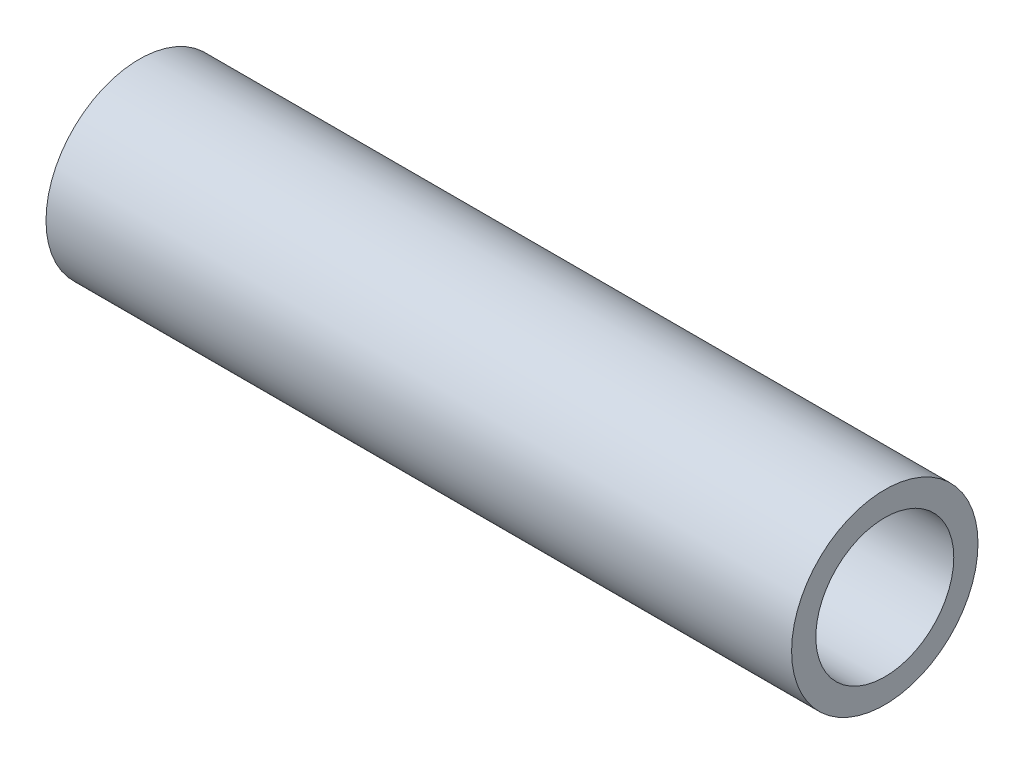
ISO-10303-21;
HEADER;
FILE_DESCRIPTION(('STEP AP214'),'2;1');
FILE_NAME('part.step','',(''),(''),'','','');
FILE_SCHEMA(('AUTOMOTIVE_DESIGN { 1 0 10303 214 1 1 1 1 }'));
ENDSEC;
DATA;
#1=APPLICATION_CONTEXT('core data for automotive mechanical design processes');
#2=APPLICATION_PROTOCOL_DEFINITION('international standard','automotive_design',2000,#1);
#3=PRODUCT_CONTEXT('',#1,'mechanical');
#4=PRODUCT('Part','Part','',(#3));
#5=PRODUCT_RELATED_PRODUCT_CATEGORY('part','',(#4));
#6=PRODUCT_DEFINITION_FORMATION('','',#4);
#7=PRODUCT_DEFINITION_CONTEXT('part definition',#1,'design');
#8=PRODUCT_DEFINITION('design','',#6,#7);
#9=PRODUCT_DEFINITION_SHAPE('','',#8);
#10=(LENGTH_UNIT() NAMED_UNIT(*) SI_UNIT(.MILLI.,.METRE.));
#11=(NAMED_UNIT(*) PLANE_ANGLE_UNIT() SI_UNIT($,.RADIAN.));
#12=(NAMED_UNIT(*) SI_UNIT($,.STERADIAN.) SOLID_ANGLE_UNIT());
#13=UNCERTAINTY_MEASURE_WITH_UNIT(LENGTH_MEASURE(1.E-05),#10,'distance_accuracy_value','');
#14=(GEOMETRIC_REPRESENTATION_CONTEXT(3) GLOBAL_UNCERTAINTY_ASSIGNED_CONTEXT((#13)) GLOBAL_UNIT_ASSIGNED_CONTEXT((#10,
#11,#12)) REPRESENTATION_CONTEXT('',''));
#15=CARTESIAN_POINT('',(0.,0.,0.));
#16=DIRECTION('',(0.,0.,1.));
#17=DIRECTION('',(1.,0.,0.));
#18=AXIS2_PLACEMENT_3D('',#15,#16,#17);
#19=CARTESIAN_POINT('',(25.4,0.,0.));
#20=DIRECTION('',(1.,0.,0.));
#21=DIRECTION('',(0.,0.,-1.));
#22=AXIS2_PLACEMENT_3D('',#19,#20,#21);
#23=PLANE('',#22);
#24=CARTESIAN_POINT('',(25.4,0.,0.));
#25=DIRECTION('',(1.,0.,0.));
#26=DIRECTION('',(0.,0.,-1.));
#27=AXIS2_PLACEMENT_3D('',#24,#25,#26);
#28=CIRCLE('',#27,6.35);
#29=CARTESIAN_POINT('',(25.4,0.,-6.35));
#30=VERTEX_POINT('',#29);
#31=EDGE_CURVE('E10',#30,#30,#28,.T.);
#32=ORIENTED_EDGE('',*,*,#31,.T.);
#33=EDGE_LOOP('',(#32));
#34=FACE_BOUND('',#33,.T.);
#35=CARTESIAN_POINT('',(25.4,0.,0.));
#36=DIRECTION('',(1.,0.,0.));
#37=DIRECTION('',(0.,0.,-1.));
#38=AXIS2_PLACEMENT_3D('',#35,#36,#37);
#39=CIRCLE('',#38,4.699);
#40=CARTESIAN_POINT('',(25.4,0.,-4.699));
#41=VERTEX_POINT('',#40);
#42=EDGE_CURVE('E44',#41,#41,#39,.T.);
#43=ORIENTED_EDGE('',*,*,#42,.F.);
#44=EDGE_LOOP('',(#43));
#45=FACE_BOUND('',#44,.T.);
#46=ADVANCED_FACE('F33',(#34,#45),#23,.T.);
#47=CARTESIAN_POINT('',(-25.4,0.,0.));
#48=DIRECTION('',(1.,0.,0.));
#49=DIRECTION('',(0.,0.,-1.));
#50=AXIS2_PLACEMENT_3D('',#47,#48,#49);
#51=PLANE('',#50);
#52=CARTESIAN_POINT('',(-25.4,0.,0.));
#53=DIRECTION('',(1.,0.,0.));
#54=DIRECTION('',(0.,0.,-1.));
#55=AXIS2_PLACEMENT_3D('',#52,#53,#54);
#56=CIRCLE('',#55,6.35);
#57=CARTESIAN_POINT('',(-25.4,0.,-6.35));
#58=VERTEX_POINT('',#57);
#59=EDGE_CURVE('E37',#58,#58,#56,.T.);
#60=ORIENTED_EDGE('',*,*,#59,.F.);
#61=EDGE_LOOP('',(#60));
#62=FACE_BOUND('',#61,.T.);
#63=CARTESIAN_POINT('',(-25.4,0.,0.));
#64=DIRECTION('',(1.,0.,0.));
#65=DIRECTION('',(0.,0.,-1.));
#66=AXIS2_PLACEMENT_3D('',#63,#64,#65);
#67=CIRCLE('',#66,4.699);
#68=CARTESIAN_POINT('',(-25.4,0.,-4.699));
#69=VERTEX_POINT('',#68);
#70=EDGE_CURVE('E46',#69,#69,#67,.T.);
#71=ORIENTED_EDGE('',*,*,#70,.T.);
#72=EDGE_LOOP('',(#71));
#73=FACE_BOUND('',#72,.T.);
#74=ADVANCED_FACE('F56',(#62,#73),#51,.F.);
#75=CARTESIAN_POINT('',(25.4,0.,0.));
#76=DIRECTION('',(-1.,0.,0.));
#77=DIRECTION('',(0.,0.,1.));
#78=AXIS2_PLACEMENT_3D('',#75,#76,#77);
#79=CYLINDRICAL_SURFACE('',#78,6.35);
#80=ORIENTED_EDGE('',*,*,#31,.F.);
#81=EDGE_LOOP('',(#80));
#82=FACE_BOUND('',#81,.T.);
#83=ORIENTED_EDGE('',*,*,#59,.T.);
#84=EDGE_LOOP('',(#83));
#85=FACE_BOUND('',#84,.T.);
#86=ADVANCED_FACE('F35',(#82,#85),#79,.T.);
#87=CARTESIAN_POINT('',(25.4,0.,0.));
#88=DIRECTION('',(-1.,0.,0.));
#89=DIRECTION('',(0.,0.,1.));
#90=AXIS2_PLACEMENT_3D('',#87,#88,#89);
#91=CYLINDRICAL_SURFACE('',#90,4.699);
#92=ORIENTED_EDGE('',*,*,#42,.T.);
#93=EDGE_LOOP('',(#92));
#94=FACE_BOUND('',#93,.T.);
#95=ORIENTED_EDGE('',*,*,#70,.F.);
#96=EDGE_LOOP('',(#95));
#97=FACE_BOUND('',#96,.T.);
#98=ADVANCED_FACE('F52',(#94,#97),#91,.F.);
#99=CLOSED_SHELL('',(#46,#74,#86,#98));
#100=MANIFOLD_SOLID_BREP('B2',#99);
#101=ADVANCED_BREP_SHAPE_REPRESENTATION('',(#18,#100),#14);
#102=SHAPE_DEFINITION_REPRESENTATION(#9,#101);
ENDSEC;
END-ISO-10303-21;
